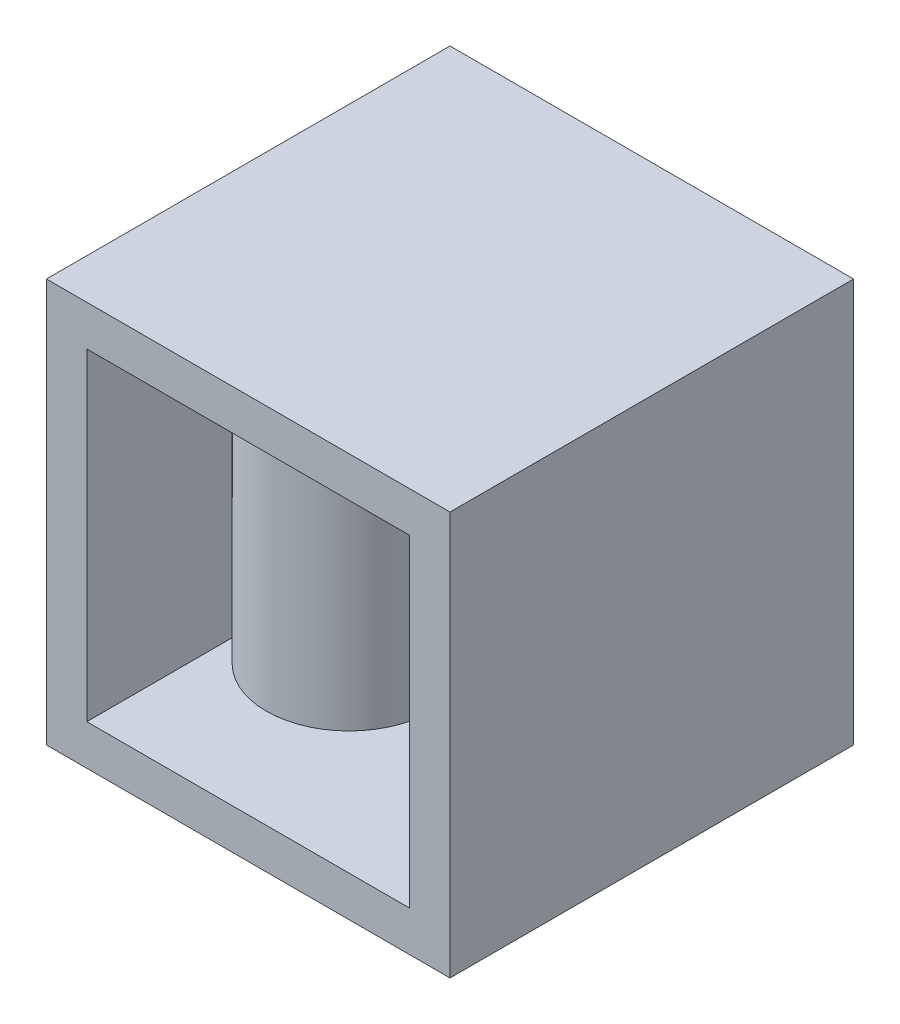
ISO-10303-21;
HEADER;
FILE_DESCRIPTION(('STEP AP214'),'2;1');
FILE_NAME('part.step','',(''),(''),'','','');
FILE_SCHEMA(('AUTOMOTIVE_DESIGN { 1 0 10303 214 1 1 1 1 }'));
ENDSEC;
DATA;
#1=APPLICATION_CONTEXT('core data for automotive mechanical design processes');
#2=APPLICATION_PROTOCOL_DEFINITION('international standard','automotive_design',2000,#1);
#3=PRODUCT_CONTEXT('',#1,'mechanical');
#4=PRODUCT('Part','Part','',(#3));
#5=PRODUCT_RELATED_PRODUCT_CATEGORY('part','',(#4));
#6=PRODUCT_DEFINITION_FORMATION('','',#4);
#7=PRODUCT_DEFINITION_CONTEXT('part definition',#1,'design');
#8=PRODUCT_DEFINITION('design','',#6,#7);
#9=PRODUCT_DEFINITION_SHAPE('','',#8);
#10=(LENGTH_UNIT() NAMED_UNIT(*) SI_UNIT(.MILLI.,.METRE.));
#11=(NAMED_UNIT(*) PLANE_ANGLE_UNIT() SI_UNIT($,.RADIAN.));
#12=(NAMED_UNIT(*) SI_UNIT($,.STERADIAN.) SOLID_ANGLE_UNIT());
#13=UNCERTAINTY_MEASURE_WITH_UNIT(LENGTH_MEASURE(1.E-05),#10,'distance_accuracy_value','');
#14=(GEOMETRIC_REPRESENTATION_CONTEXT(3) GLOBAL_UNCERTAINTY_ASSIGNED_CONTEXT((#13)) GLOBAL_UNIT_ASSIGNED_CONTEXT((#10,
#11,#12)) REPRESENTATION_CONTEXT('',''));
#15=CARTESIAN_POINT('',(0.,0.,0.));
#16=DIRECTION('',(0.,0.,1.));
#17=DIRECTION('',(1.,0.,0.));
#18=AXIS2_PLACEMENT_3D('',#15,#16,#17);
#19=CARTESIAN_POINT('',(0.,900.,1000.));
#20=DIRECTION('',(0.,1.,0.));
#21=DIRECTION('',(0.,0.,1.));
#22=AXIS2_PLACEMENT_3D('',#19,#20,#21);
#23=PLANE('',#22);
#24=CARTESIAN_POINT('',(500.,900.,750.));
#25=DIRECTION('',(0.,1.,0.));
#26=DIRECTION('',(0.,0.,1.));
#27=AXIS2_PLACEMENT_3D('',#24,#25,#26);
#28=CIRCLE('',#27,205.);
#29=CARTESIAN_POINT('',(500.,900.,955.));
#30=VERTEX_POINT('',#29);
#31=EDGE_CURVE('E11',#30,#30,#28,.F.);
#32=ORIENTED_EDGE('',*,*,#31,.F.);
#33=EDGE_LOOP('',(#32));
#34=FACE_BOUND('',#33,.T.);
#35=DIRECTION('',(1.,0.,0.));
#36=VECTOR('',#35,1.);
#37=CARTESIAN_POINT('',(0.,900.,0.));
#38=LINE('',#37,#36);
#39=CARTESIAN_POINT('',(100.,900.,0.));
#40=VERTEX_POINT('',#39);
#41=CARTESIAN_POINT('',(900.,900.,0.));
#42=VERTEX_POINT('',#41);
#43=EDGE_CURVE('E145',#40,#42,#38,.T.);
#44=ORIENTED_EDGE('',*,*,#43,.T.);
#45=DIRECTION('',(0.,0.,-1.));
#46=VECTOR('',#45,1.);
#47=CARTESIAN_POINT('',(900.,900.,1000.));
#48=LINE('',#47,#46);
#49=CARTESIAN_POINT('',(900.,900.,1000.));
#50=VERTEX_POINT('',#49);
#51=EDGE_CURVE('E44',#50,#42,#48,.T.);
#52=ORIENTED_EDGE('',*,*,#51,.F.);
#53=DIRECTION('',(1.,0.,0.));
#54=VECTOR('',#53,1.);
#55=CARTESIAN_POINT('',(0.,900.,1000.));
#56=LINE('',#55,#54);
#57=CARTESIAN_POINT('',(100.,900.,1000.));
#58=VERTEX_POINT('',#57);
#59=EDGE_CURVE('E113',#58,#50,#56,.T.);
#60=ORIENTED_EDGE('',*,*,#59,.F.);
#61=DIRECTION('',(0.,0.,-1.));
#62=VECTOR('',#61,1.);
#63=CARTESIAN_POINT('',(100.,900.,1000.));
#64=LINE('',#63,#62);
#65=EDGE_CURVE('E52',#58,#40,#64,.T.);
#66=ORIENTED_EDGE('',*,*,#65,.T.);
#67=EDGE_LOOP('',(#44,#52,#60,#66));
#68=FACE_BOUND('',#67,.T.);
#69=ADVANCED_FACE('F35',(#34,#68),#23,.F.);
#70=CARTESIAN_POINT('',(900.,1.2490009027033E-13,1000.));
#71=DIRECTION('',(1.,0.,0.));
#72=DIRECTION('',(0.,1.,0.));
#73=AXIS2_PLACEMENT_3D('',#70,#71,#72);
#74=PLANE('',#73);
#75=DIRECTION('',(0.,-1.,0.));
#76=VECTOR('',#75,1.);
#77=CARTESIAN_POINT('',(900.,1.2490009027033E-13,0.));
#78=LINE('',#77,#76);
#79=CARTESIAN_POINT('',(900.,100.,0.));
#80=VERTEX_POINT('',#79);
#81=EDGE_CURVE('E121',#42,#80,#78,.T.);
#82=ORIENTED_EDGE('',*,*,#81,.T.);
#83=DIRECTION('',(0.,0.,-1.));
#84=VECTOR('',#83,1.);
#85=CARTESIAN_POINT('',(900.,100.,1000.));
#86=LINE('',#85,#84);
#87=CARTESIAN_POINT('',(900.,100.,1000.));
#88=VERTEX_POINT('',#87);
#89=EDGE_CURVE('E119',#88,#80,#86,.T.);
#90=ORIENTED_EDGE('',*,*,#89,.F.);
#91=DIRECTION('',(0.,-1.,0.));
#92=VECTOR('',#91,1.);
#93=CARTESIAN_POINT('',(900.,1.2490009027033E-13,1000.));
#94=LINE('',#93,#92);
#95=EDGE_CURVE('E107',#50,#88,#94,.T.);
#96=ORIENTED_EDGE('',*,*,#95,.F.);
#97=ORIENTED_EDGE('',*,*,#51,.T.);
#98=EDGE_LOOP('',(#82,#90,#96,#97));
#99=FACE_BOUND('',#98,.T.);
#100=ADVANCED_FACE('F120',(#99),#74,.F.);
#101=CARTESIAN_POINT('',(0.,100.,1000.));
#102=DIRECTION('',(0.,1.,0.));
#103=DIRECTION('',(0.,0.,1.));
#104=AXIS2_PLACEMENT_3D('',#101,#102,#103);
#105=PLANE('',#104);
#106=DIRECTION('',(1.,0.,0.));
#107=VECTOR('',#106,1.);
#108=CARTESIAN_POINT('',(0.,100.,0.));
#109=LINE('',#108,#107);
#110=CARTESIAN_POINT('',(100.,100.,0.));
#111=VERTEX_POINT('',#110);
#112=EDGE_CURVE('E148',#111,#80,#109,.T.);
#113=ORIENTED_EDGE('',*,*,#112,.F.);
#114=DIRECTION('',(0.,0.,-1.));
#115=VECTOR('',#114,1.);
#116=CARTESIAN_POINT('',(100.,100.,1000.));
#117=LINE('',#116,#115);
#118=CARTESIAN_POINT('',(100.,100.,1000.));
#119=VERTEX_POINT('',#118);
#120=EDGE_CURVE('E78',#119,#111,#117,.T.);
#121=ORIENTED_EDGE('',*,*,#120,.F.);
#122=DIRECTION('',(1.,0.,0.));
#123=VECTOR('',#122,1.);
#124=CARTESIAN_POINT('',(0.,100.,1000.));
#125=LINE('',#124,#123);
#126=EDGE_CURVE('E112',#119,#88,#125,.T.);
#127=ORIENTED_EDGE('',*,*,#126,.T.);
#128=ORIENTED_EDGE('',*,*,#89,.T.);
#129=EDGE_LOOP('',(#113,#121,#127,#128));
#130=FACE_BOUND('',#129,.T.);
#131=ADVANCED_FACE('F125',(#130),#105,.T.);
#132=CARTESIAN_POINT('',(0.,0.,1000.));
#133=DIRECTION('',(0.,1.,0.));
#134=DIRECTION('',(0.,0.,1.));
#135=AXIS2_PLACEMENT_3D('',#132,#133,#134);
#136=PLANE('',#135);
#137=DIRECTION('',(1.,0.,0.));
#138=VECTOR('',#137,1.);
#139=CARTESIAN_POINT('',(0.,0.,0.));
#140=LINE('',#139,#138);
#141=CARTESIAN_POINT('',(0.,0.,0.));
#142=VERTEX_POINT('',#141);
#143=CARTESIAN_POINT('',(1000.,0.,0.));
#144=VERTEX_POINT('',#143);
#145=EDGE_CURVE('E132',#142,#144,#140,.T.);
#146=ORIENTED_EDGE('',*,*,#145,.T.);
#147=DIRECTION('',(0.,0.,-1.));
#148=VECTOR('',#147,1.);
#149=CARTESIAN_POINT('',(1000.,0.,1000.));
#150=LINE('',#149,#148);
#151=CARTESIAN_POINT('',(1000.,0.,1000.));
#152=VERTEX_POINT('',#151);
#153=EDGE_CURVE('E155',#152,#144,#150,.T.);
#154=ORIENTED_EDGE('',*,*,#153,.F.);
#155=DIRECTION('',(1.,0.,0.));
#156=VECTOR('',#155,1.);
#157=CARTESIAN_POINT('',(0.,0.,1000.));
#158=LINE('',#157,#156);
#159=CARTESIAN_POINT('',(0.,0.,1000.));
#160=VERTEX_POINT('',#159);
#161=EDGE_CURVE('E153',#160,#152,#158,.T.);
#162=ORIENTED_EDGE('',*,*,#161,.F.);
#163=DIRECTION('',(0.,0.,-1.));
#164=VECTOR('',#163,1.);
#165=CARTESIAN_POINT('',(0.,0.,1000.));
#166=LINE('',#165,#164);
#167=EDGE_CURVE('E128',#160,#142,#166,.T.);
#168=ORIENTED_EDGE('',*,*,#167,.T.);
#169=EDGE_LOOP('',(#146,#154,#162,#168));
#170=FACE_BOUND('',#169,.T.);
#171=ADVANCED_FACE('F37',(#170),#136,.F.);
#172=CARTESIAN_POINT('',(1000.,0.,1000.));
#173=DIRECTION('',(-1.,0.,0.));
#174=DIRECTION('',(0.,0.,1.));
#175=AXIS2_PLACEMENT_3D('',#172,#173,#174);
#176=PLANE('',#175);
#177=DIRECTION('',(0.,1.,0.));
#178=VECTOR('',#177,1.);
#179=CARTESIAN_POINT('',(1000.,0.,0.));
#180=LINE('',#179,#178);
#181=CARTESIAN_POINT('',(1000.,1000.,0.));
#182=VERTEX_POINT('',#181);
#183=EDGE_CURVE('E135',#144,#182,#180,.T.);
#184=ORIENTED_EDGE('',*,*,#183,.T.);
#185=DIRECTION('',(0.,0.,-1.));
#186=VECTOR('',#185,1.);
#187=CARTESIAN_POINT('',(1000.,1000.,1000.));
#188=LINE('',#187,#186);
#189=CARTESIAN_POINT('',(1000.,1000.,1000.));
#190=VERTEX_POINT('',#189);
#191=EDGE_CURVE('E161',#190,#182,#188,.T.);
#192=ORIENTED_EDGE('',*,*,#191,.F.);
#193=DIRECTION('',(0.,1.,0.));
#194=VECTOR('',#193,1.);
#195=CARTESIAN_POINT('',(1000.,0.,1000.));
#196=LINE('',#195,#194);
#197=EDGE_CURVE('E91',#152,#190,#196,.T.);
#198=ORIENTED_EDGE('',*,*,#197,.F.);
#199=ORIENTED_EDGE('',*,*,#153,.T.);
#200=EDGE_LOOP('',(#184,#192,#198,#199));
#201=FACE_BOUND('',#200,.T.);
#202=ADVANCED_FACE('F163',(#201),#176,.F.);
#203=CARTESIAN_POINT('',(0.,1000.,1000.));
#204=DIRECTION('',(0.,1.,0.));
#205=DIRECTION('',(0.,0.,1.));
#206=AXIS2_PLACEMENT_3D('',#203,#204,#205);
#207=PLANE('',#206);
#208=DIRECTION('',(1.,0.,0.));
#209=VECTOR('',#208,1.);
#210=CARTESIAN_POINT('',(0.,1000.,0.));
#211=LINE('',#210,#209);
#212=CARTESIAN_POINT('',(0.,1000.,0.));
#213=VERTEX_POINT('',#212);
#214=EDGE_CURVE('E139',#213,#182,#211,.T.);
#215=ORIENTED_EDGE('',*,*,#214,.F.);
#216=DIRECTION('',(0.,0.,-1.));
#217=VECTOR('',#216,1.);
#218=CARTESIAN_POINT('',(0.,1000.,1000.));
#219=LINE('',#218,#217);
#220=CARTESIAN_POINT('',(0.,1000.,1000.));
#221=VERTEX_POINT('',#220);
#222=EDGE_CURVE('E159',#221,#213,#219,.T.);
#223=ORIENTED_EDGE('',*,*,#222,.F.);
#224=DIRECTION('',(1.,0.,0.));
#225=VECTOR('',#224,1.);
#226=CARTESIAN_POINT('',(0.,1000.,1000.));
#227=LINE('',#226,#225);
#228=EDGE_CURVE('E181',#221,#190,#227,.T.);
#229=ORIENTED_EDGE('',*,*,#228,.T.);
#230=ORIENTED_EDGE('',*,*,#191,.T.);
#231=EDGE_LOOP('',(#215,#223,#229,#230));
#232=FACE_BOUND('',#231,.T.);
#233=ADVANCED_FACE('F180',(#232),#207,.T.);
#234=CARTESIAN_POINT('',(0.,0.,1000.));
#235=DIRECTION('',(-1.,0.,0.));
#236=DIRECTION('',(0.,0.,1.));
#237=AXIS2_PLACEMENT_3D('',#234,#235,#236);
#238=PLANE('',#237);
#239=DIRECTION('',(0.,1.,0.));
#240=VECTOR('',#239,1.);
#241=CARTESIAN_POINT('',(0.,0.,0.));
#242=LINE('',#241,#240);
#243=EDGE_CURVE('E142',#142,#213,#242,.T.);
#244=ORIENTED_EDGE('',*,*,#243,.F.);
#245=ORIENTED_EDGE('',*,*,#167,.F.);
#246=DIRECTION('',(0.,1.,0.));
#247=VECTOR('',#246,1.);
#248=CARTESIAN_POINT('',(0.,0.,1000.));
#249=LINE('',#248,#247);
#250=EDGE_CURVE('E176',#160,#221,#249,.T.);
#251=ORIENTED_EDGE('',*,*,#250,.T.);
#252=ORIENTED_EDGE('',*,*,#222,.T.);
#253=EDGE_LOOP('',(#244,#245,#251,#252));
#254=FACE_BOUND('',#253,.T.);
#255=ADVANCED_FACE('F172',(#254),#238,.T.);
#256=CARTESIAN_POINT('',(100.,0.,1000.));
#257=DIRECTION('',(1.,0.,0.));
#258=DIRECTION('',(0.,1.,0.));
#259=AXIS2_PLACEMENT_3D('',#256,#257,#258);
#260=PLANE('',#259);
#261=DIRECTION('',(0.,-1.,0.));
#262=VECTOR('',#261,1.);
#263=CARTESIAN_POINT('',(100.,0.,0.));
#264=LINE('',#263,#262);
#265=EDGE_CURVE('E150',#40,#111,#264,.T.);
#266=ORIENTED_EDGE('',*,*,#265,.F.);
#267=ORIENTED_EDGE('',*,*,#65,.F.);
#268=DIRECTION('',(0.,-1.,0.));
#269=VECTOR('',#268,1.);
#270=CARTESIAN_POINT('',(100.,0.,1000.));
#271=LINE('',#270,#269);
#272=EDGE_CURVE('E126',#58,#119,#271,.T.);
#273=ORIENTED_EDGE('',*,*,#272,.T.);
#274=ORIENTED_EDGE('',*,*,#120,.T.);
#275=EDGE_LOOP('',(#266,#267,#273,#274));
#276=FACE_BOUND('',#275,.T.);
#277=ADVANCED_FACE('F201',(#276),#260,.T.);
#278=CARTESIAN_POINT('',(0.,0.,1000.));
#279=DIRECTION('',(0.,0.,1.));
#280=DIRECTION('',(1.,0.,0.));
#281=AXIS2_PLACEMENT_3D('',#278,#279,#280);
#282=PLANE('',#281);
#283=ORIENTED_EDGE('',*,*,#161,.T.);
#284=ORIENTED_EDGE('',*,*,#197,.T.);
#285=ORIENTED_EDGE('',*,*,#228,.F.);
#286=ORIENTED_EDGE('',*,*,#250,.F.);
#287=EDGE_LOOP('',(#283,#284,#285,#286));
#288=FACE_BOUND('',#287,.T.);
#289=ORIENTED_EDGE('',*,*,#59,.T.);
#290=ORIENTED_EDGE('',*,*,#95,.T.);
#291=ORIENTED_EDGE('',*,*,#126,.F.);
#292=ORIENTED_EDGE('',*,*,#272,.F.);
#293=EDGE_LOOP('',(#289,#290,#291,#292));
#294=FACE_BOUND('',#293,.T.);
#295=ADVANCED_FACE('F109',(#288,#294),#282,.T.);
#296=CARTESIAN_POINT('',(0.,0.,0.));
#297=DIRECTION('',(0.,0.,1.));
#298=DIRECTION('',(1.,0.,0.));
#299=AXIS2_PLACEMENT_3D('',#296,#297,#298);
#300=PLANE('',#299);
#301=ORIENTED_EDGE('',*,*,#145,.F.);
#302=ORIENTED_EDGE('',*,*,#243,.T.);
#303=ORIENTED_EDGE('',*,*,#214,.T.);
#304=ORIENTED_EDGE('',*,*,#183,.F.);
#305=EDGE_LOOP('',(#301,#302,#303,#304));
#306=FACE_BOUND('',#305,.T.);
#307=ORIENTED_EDGE('',*,*,#43,.F.);
#308=ORIENTED_EDGE('',*,*,#265,.T.);
#309=ORIENTED_EDGE('',*,*,#112,.T.);
#310=ORIENTED_EDGE('',*,*,#81,.F.);
#311=EDGE_LOOP('',(#307,#308,#309,#310));
#312=FACE_BOUND('',#311,.T.);
#313=ADVANCED_FACE('F169',(#306,#312),#300,.F.);
#314=CARTESIAN_POINT('',(500.,300.,750.));
#315=DIRECTION('',(0.,1.,0.));
#316=DIRECTION('',(0.,0.,1.));
#317=AXIS2_PLACEMENT_3D('',#314,#315,#316);
#318=CYLINDRICAL_SURFACE('',#317,205.);
#319=CARTESIAN_POINT('',(500.,300.,750.));
#320=DIRECTION('',(0.,-1.,0.));
#321=DIRECTION('',(0.,0.,-1.));
#322=AXIS2_PLACEMENT_3D('',#319,#320,#321);
#323=CIRCLE('',#322,205.);
#324=CARTESIAN_POINT('',(500.,300.,545.));
#325=VERTEX_POINT('',#324);
#326=EDGE_CURVE('E136',#325,#325,#323,.T.);
#327=ORIENTED_EDGE('',*,*,#326,.F.);
#328=EDGE_LOOP('',(#327));
#329=FACE_BOUND('',#328,.T.);
#330=ORIENTED_EDGE('',*,*,#31,.T.);
#331=EDGE_LOOP('',(#330));
#332=FACE_BOUND('',#331,.T.);
#333=ADVANCED_FACE('F193',(#329,#332),#318,.T.);
#334=CARTESIAN_POINT('',(500.,300.,750.));
#335=DIRECTION('',(0.,-1.,0.));
#336=DIRECTION('',(0.,0.,-1.));
#337=AXIS2_PLACEMENT_3D('',#334,#335,#336);
#338=PLANE('',#337);
#339=ORIENTED_EDGE('',*,*,#326,.T.);
#340=EDGE_LOOP('',(#339));
#341=FACE_BOUND('',#340,.T.);
#342=ADVANCED_FACE('F191',(#341),#338,.T.);
#343=CLOSED_SHELL('',(#69,#100,#131,#171,#202,#233,#255,#277,#295,#313,#333,#342));
#344=MANIFOLD_SOLID_BREP('B2',#343);
#345=ADVANCED_BREP_SHAPE_REPRESENTATION('',(#18,#344),#14);
#346=SHAPE_DEFINITION_REPRESENTATION(#9,#345);
ENDSEC;
END-ISO-10303-21;
